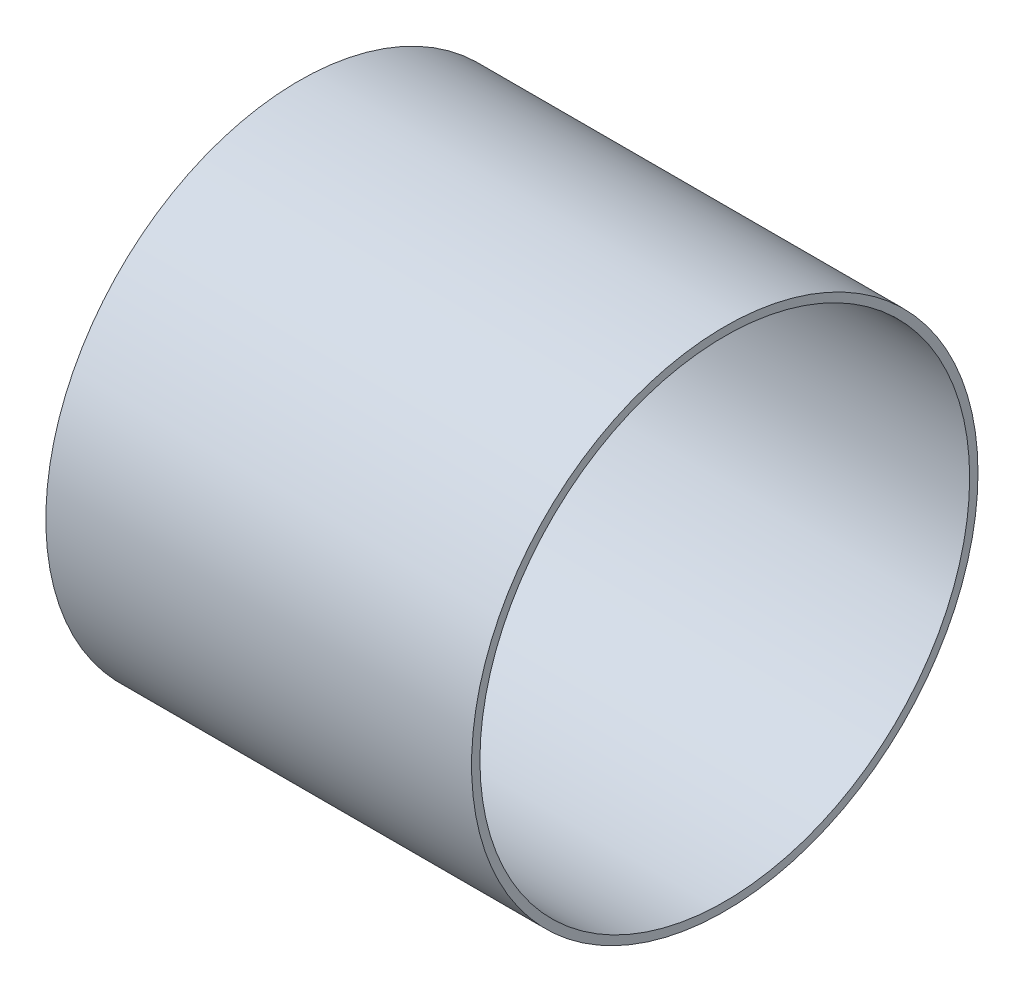
ISO-10303-21;
HEADER;
FILE_DESCRIPTION(('STEP AP214'),'2;1');
FILE_NAME('part.step','',(''),(''),'','','');
FILE_SCHEMA(('AUTOMOTIVE_DESIGN { 1 0 10303 214 1 1 1 1 }'));
ENDSEC;
DATA;
#1=APPLICATION_CONTEXT('core data for automotive mechanical design processes');
#2=APPLICATION_PROTOCOL_DEFINITION('international standard','automotive_design',2000,#1);
#3=PRODUCT_CONTEXT('',#1,'mechanical');
#4=PRODUCT('Part','Part','',(#3));
#5=PRODUCT_RELATED_PRODUCT_CATEGORY('part','',(#4));
#6=PRODUCT_DEFINITION_FORMATION('','',#4);
#7=PRODUCT_DEFINITION_CONTEXT('part definition',#1,'design');
#8=PRODUCT_DEFINITION('design','',#6,#7);
#9=PRODUCT_DEFINITION_SHAPE('','',#8);
#10=(LENGTH_UNIT() NAMED_UNIT(*) SI_UNIT(.MILLI.,.METRE.));
#11=(NAMED_UNIT(*) PLANE_ANGLE_UNIT() SI_UNIT($,.RADIAN.));
#12=(NAMED_UNIT(*) SI_UNIT($,.STERADIAN.) SOLID_ANGLE_UNIT());
#13=UNCERTAINTY_MEASURE_WITH_UNIT(LENGTH_MEASURE(1.E-05),#10,'distance_accuracy_value','');
#14=(GEOMETRIC_REPRESENTATION_CONTEXT(3) GLOBAL_UNCERTAINTY_ASSIGNED_CONTEXT((#13)) GLOBAL_UNIT_ASSIGNED_CONTEXT((#10,
#11,#12)) REPRESENTATION_CONTEXT('',''));
#15=CARTESIAN_POINT('',(0.,0.,0.));
#16=DIRECTION('',(0.,0.,1.));
#17=DIRECTION('',(1.,0.,0.));
#18=AXIS2_PLACEMENT_3D('',#15,#16,#17);
#19=CARTESIAN_POINT('',(38.25,0.,0.));
#20=DIRECTION('',(1.,0.,0.));
#21=DIRECTION('',(0.,0.,-1.));
#22=AXIS2_PLACEMENT_3D('',#19,#20,#21);
#23=PLANE('',#22);
#24=CARTESIAN_POINT('',(38.25,0.,0.));
#25=DIRECTION('',(1.,0.,0.));
#26=DIRECTION('',(0.,0.,-1.));
#27=AXIS2_PLACEMENT_3D('',#24,#25,#26);
#28=CIRCLE('',#27,45.5);
#29=CARTESIAN_POINT('',(38.25,0.,-45.5));
#30=VERTEX_POINT('',#29);
#31=EDGE_CURVE('E10',#30,#30,#28,.T.);
#32=ORIENTED_EDGE('',*,*,#31,.T.);
#33=EDGE_LOOP('',(#32));
#34=FACE_BOUND('',#33,.T.);
#35=CARTESIAN_POINT('',(38.25,0.,0.));
#36=DIRECTION('',(1.,0.,0.));
#37=DIRECTION('',(0.,0.,-1.));
#38=AXIS2_PLACEMENT_3D('',#35,#36,#37);
#39=CIRCLE('',#38,44.);
#40=CARTESIAN_POINT('',(38.25,0.,-44.));
#41=VERTEX_POINT('',#40);
#42=EDGE_CURVE('E44',#41,#41,#39,.T.);
#43=ORIENTED_EDGE('',*,*,#42,.F.);
#44=EDGE_LOOP('',(#43));
#45=FACE_BOUND('',#44,.T.);
#46=ADVANCED_FACE('F33',(#34,#45),#23,.T.);
#47=CARTESIAN_POINT('',(-38.25,0.,0.));
#48=DIRECTION('',(1.,0.,0.));
#49=DIRECTION('',(0.,0.,-1.));
#50=AXIS2_PLACEMENT_3D('',#47,#48,#49);
#51=PLANE('',#50);
#52=CARTESIAN_POINT('',(-38.25,0.,0.));
#53=DIRECTION('',(1.,0.,0.));
#54=DIRECTION('',(0.,0.,-1.));
#55=AXIS2_PLACEMENT_3D('',#52,#53,#54);
#56=CIRCLE('',#55,45.5);
#57=CARTESIAN_POINT('',(-38.25,0.,-45.5));
#58=VERTEX_POINT('',#57);
#59=EDGE_CURVE('E37',#58,#58,#56,.T.);
#60=ORIENTED_EDGE('',*,*,#59,.F.);
#61=EDGE_LOOP('',(#60));
#62=FACE_BOUND('',#61,.T.);
#63=CARTESIAN_POINT('',(-38.25,0.,0.));
#64=DIRECTION('',(1.,0.,0.));
#65=DIRECTION('',(0.,0.,-1.));
#66=AXIS2_PLACEMENT_3D('',#63,#64,#65);
#67=CIRCLE('',#66,44.);
#68=CARTESIAN_POINT('',(-38.25,0.,-44.));
#69=VERTEX_POINT('',#68);
#70=EDGE_CURVE('E46',#69,#69,#67,.T.);
#71=ORIENTED_EDGE('',*,*,#70,.T.);
#72=EDGE_LOOP('',(#71));
#73=FACE_BOUND('',#72,.T.);
#74=ADVANCED_FACE('F56',(#62,#73),#51,.F.);
#75=CARTESIAN_POINT('',(38.25,0.,0.));
#76=DIRECTION('',(-1.,0.,0.));
#77=DIRECTION('',(0.,0.,1.));
#78=AXIS2_PLACEMENT_3D('',#75,#76,#77);
#79=CYLINDRICAL_SURFACE('',#78,45.5);
#80=ORIENTED_EDGE('',*,*,#31,.F.);
#81=EDGE_LOOP('',(#80));
#82=FACE_BOUND('',#81,.T.);
#83=ORIENTED_EDGE('',*,*,#59,.T.);
#84=EDGE_LOOP('',(#83));
#85=FACE_BOUND('',#84,.T.);
#86=ADVANCED_FACE('F35',(#82,#85),#79,.T.);
#87=CARTESIAN_POINT('',(38.25,0.,0.));
#88=DIRECTION('',(-1.,0.,0.));
#89=DIRECTION('',(0.,0.,1.));
#90=AXIS2_PLACEMENT_3D('',#87,#88,#89);
#91=CYLINDRICAL_SURFACE('',#90,44.);
#92=ORIENTED_EDGE('',*,*,#42,.T.);
#93=EDGE_LOOP('',(#92));
#94=FACE_BOUND('',#93,.T.);
#95=ORIENTED_EDGE('',*,*,#70,.F.);
#96=EDGE_LOOP('',(#95));
#97=FACE_BOUND('',#96,.T.);
#98=ADVANCED_FACE('F52',(#94,#97),#91,.F.);
#99=CLOSED_SHELL('',(#46,#74,#86,#98));
#100=MANIFOLD_SOLID_BREP('B2',#99);
#101=ADVANCED_BREP_SHAPE_REPRESENTATION('',(#18,#100),#14);
#102=SHAPE_DEFINITION_REPRESENTATION(#9,#101);
ENDSEC;
END-ISO-10303-21;
